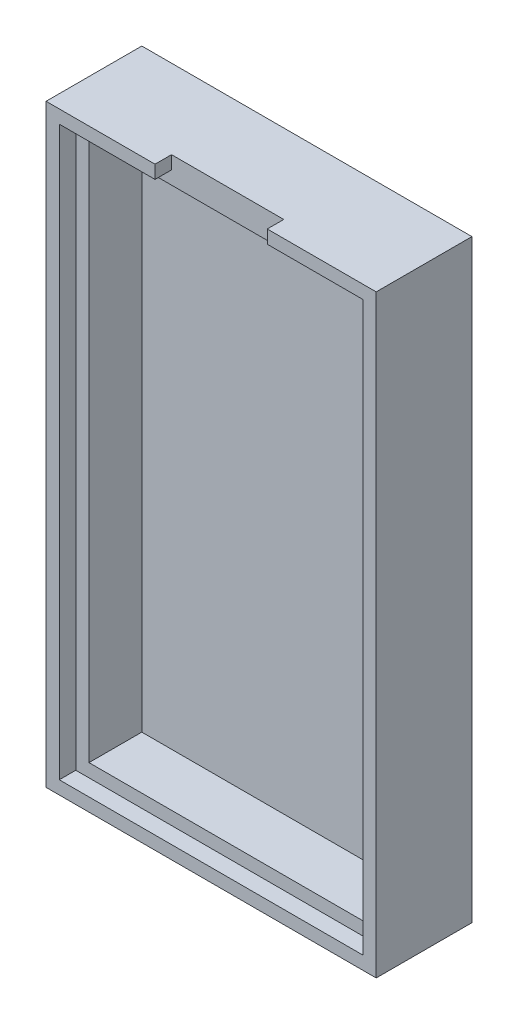
ISO-10303-21;
HEADER;
FILE_DESCRIPTION(('STEP AP214'),'2;1');
FILE_NAME('part.step','',(''),(''),'','','');
FILE_SCHEMA(('AUTOMOTIVE_DESIGN { 1 0 10303 214 1 1 1 1 }'));
ENDSEC;
DATA;
#1=APPLICATION_CONTEXT('core data for automotive mechanical design processes');
#2=APPLICATION_PROTOCOL_DEFINITION('international standard','automotive_design',2000,#1);
#3=PRODUCT_CONTEXT('',#1,'mechanical');
#4=PRODUCT('Part','Part','',(#3));
#5=PRODUCT_RELATED_PRODUCT_CATEGORY('part','',(#4));
#6=PRODUCT_DEFINITION_FORMATION('','',#4);
#7=PRODUCT_DEFINITION_CONTEXT('part definition',#1,'design');
#8=PRODUCT_DEFINITION('design','',#6,#7);
#9=PRODUCT_DEFINITION_SHAPE('','',#8);
#10=(LENGTH_UNIT() NAMED_UNIT(*) SI_UNIT(.MILLI.,.METRE.));
#11=(NAMED_UNIT(*) PLANE_ANGLE_UNIT() SI_UNIT($,.RADIAN.));
#12=(NAMED_UNIT(*) SI_UNIT($,.STERADIAN.) SOLID_ANGLE_UNIT());
#13=UNCERTAINTY_MEASURE_WITH_UNIT(LENGTH_MEASURE(1.E-05),#10,'distance_accuracy_value','');
#14=(GEOMETRIC_REPRESENTATION_CONTEXT(3) GLOBAL_UNCERTAINTY_ASSIGNED_CONTEXT((#13)) GLOBAL_UNIT_ASSIGNED_CONTEXT((#10,
#11,#12)) REPRESENTATION_CONTEXT('',''));
#15=CARTESIAN_POINT('',(0.,0.,0.));
#16=DIRECTION('',(0.,0.,1.));
#17=DIRECTION('',(1.,0.,0.));
#18=AXIS2_PLACEMENT_3D('',#15,#16,#17);
#19=CARTESIAN_POINT('',(-15.875,28.575,4.60375));
#20=DIRECTION('',(1.,0.,0.));
#21=DIRECTION('',(0.,0.,-1.));
#22=AXIS2_PLACEMENT_3D('',#19,#20,#21);
#23=PLANE('',#22);
#24=DIRECTION('',(0.,-1.,0.));
#25=VECTOR('',#24,1.);
#26=CARTESIAN_POINT('',(-15.875,28.575,-4.60375));
#27=LINE('',#26,#25);
#28=CARTESIAN_POINT('',(-15.875,28.575,-4.60375));
#29=VERTEX_POINT('',#28);
#30=CARTESIAN_POINT('',(-15.875,-28.575,-4.60375));
#31=VERTEX_POINT('',#30);
#32=EDGE_CURVE('E231',#29,#31,#27,.T.);
#33=ORIENTED_EDGE('',*,*,#32,.T.);
#34=DIRECTION('',(0.,0.,-1.));
#35=VECTOR('',#34,1.);
#36=CARTESIAN_POINT('',(-15.875,-28.575,4.60375));
#37=LINE('',#36,#35);
#38=CARTESIAN_POINT('',(-15.875,-28.575,4.60375));
#39=VERTEX_POINT('',#38);
#40=EDGE_CURVE('E42',#39,#31,#37,.T.);
#41=ORIENTED_EDGE('',*,*,#40,.F.);
#42=DIRECTION('',(0.,-1.,0.));
#43=VECTOR('',#42,1.);
#44=CARTESIAN_POINT('',(-15.875,28.575,4.60375));
#45=LINE('',#44,#43);
#46=CARTESIAN_POINT('',(-15.875,28.575,4.60375));
#47=VERTEX_POINT('',#46);
#48=EDGE_CURVE('E246',#47,#39,#45,.T.);
#49=ORIENTED_EDGE('',*,*,#48,.F.);
#50=DIRECTION('',(0.,0.,-1.));
#51=VECTOR('',#50,1.);
#52=CARTESIAN_POINT('',(-15.875,28.575,4.60375));
#53=LINE('',#52,#51);
#54=EDGE_CURVE('E254',#47,#29,#53,.T.);
#55=ORIENTED_EDGE('',*,*,#54,.T.);
#56=EDGE_LOOP('',(#33,#41,#49,#55));
#57=FACE_BOUND('',#56,.T.);
#58=ADVANCED_FACE('F35',(#57),#23,.F.);
#59=CARTESIAN_POINT('',(-15.875,-28.575,4.60375));
#60=DIRECTION('',(0.,1.,0.));
#61=DIRECTION('',(0.,0.,1.));
#62=AXIS2_PLACEMENT_3D('',#59,#60,#61);
#63=PLANE('',#62);
#64=DIRECTION('',(1.,0.,0.));
#65=VECTOR('',#64,1.);
#66=CARTESIAN_POINT('',(-15.875,-28.575,-4.60375));
#67=LINE('',#66,#65);
#68=CARTESIAN_POINT('',(15.875,-28.575,-4.60375));
#69=VERTEX_POINT('',#68);
#70=EDGE_CURVE('E257',#31,#69,#67,.T.);
#71=ORIENTED_EDGE('',*,*,#70,.T.);
#72=DIRECTION('',(0.,0.,-1.));
#73=VECTOR('',#72,1.);
#74=CARTESIAN_POINT('',(15.875,-28.575,4.60375));
#75=LINE('',#74,#73);
#76=CARTESIAN_POINT('',(15.875,-28.575,4.60375));
#77=VERTEX_POINT('',#76);
#78=EDGE_CURVE('E265',#77,#69,#75,.T.);
#79=ORIENTED_EDGE('',*,*,#78,.F.);
#80=DIRECTION('',(1.,0.,0.));
#81=VECTOR('',#80,1.);
#82=CARTESIAN_POINT('',(-15.875,-28.575,4.60375));
#83=LINE('',#82,#81);
#84=EDGE_CURVE('E87',#39,#77,#83,.T.);
#85=ORIENTED_EDGE('',*,*,#84,.F.);
#86=ORIENTED_EDGE('',*,*,#40,.T.);
#87=EDGE_LOOP('',(#71,#79,#85,#86));
#88=FACE_BOUND('',#87,.T.);
#89=ADVANCED_FACE('F268',(#88),#63,.F.);
#90=CARTESIAN_POINT('',(15.875,28.575,4.60375));
#91=DIRECTION('',(-1.,0.,0.));
#92=DIRECTION('',(0.,0.,1.));
#93=AXIS2_PLACEMENT_3D('',#90,#91,#92);
#94=PLANE('',#93);
#95=DIRECTION('',(0.,1.,0.));
#96=VECTOR('',#95,1.);
#97=CARTESIAN_POINT('',(15.875,28.575,-4.60375));
#98=LINE('',#97,#96);
#99=CARTESIAN_POINT('',(15.875,28.575,-4.60375));
#100=VERTEX_POINT('',#99);
#101=EDGE_CURVE('E259',#69,#100,#98,.T.);
#102=ORIENTED_EDGE('',*,*,#101,.T.);
#103=DIRECTION('',(0.,0.,-1.));
#104=VECTOR('',#103,1.);
#105=CARTESIAN_POINT('',(15.875,28.575,4.60375));
#106=LINE('',#105,#104);
#107=CARTESIAN_POINT('',(15.875,28.575,4.60375));
#108=VERTEX_POINT('',#107);
#109=EDGE_CURVE('E263',#108,#100,#106,.T.);
#110=ORIENTED_EDGE('',*,*,#109,.F.);
#111=DIRECTION('',(0.,1.,0.));
#112=VECTOR('',#111,1.);
#113=CARTESIAN_POINT('',(15.875,28.575,4.60375));
#114=LINE('',#113,#112);
#115=EDGE_CURVE('E249',#77,#108,#114,.T.);
#116=ORIENTED_EDGE('',*,*,#115,.F.);
#117=ORIENTED_EDGE('',*,*,#78,.T.);
#118=EDGE_LOOP('',(#102,#110,#116,#117));
#119=FACE_BOUND('',#118,.T.);
#120=ADVANCED_FACE('F277',(#119),#94,.F.);
#121=CARTESIAN_POINT('',(-15.875,28.575,4.60375));
#122=DIRECTION('',(0.,-1.,0.));
#123=DIRECTION('',(0.,0.,-1.));
#124=AXIS2_PLACEMENT_3D('',#121,#122,#123);
#125=PLANE('',#124);
#126=DIRECTION('',(-1.,0.,0.));
#127=VECTOR('',#126,1.);
#128=CARTESIAN_POINT('',(-5.3975,28.575,3.01625));
#129=LINE('',#128,#127);
#130=CARTESIAN_POINT('',(5.3975,28.575,3.01625));
#131=VERTEX_POINT('',#130);
#132=CARTESIAN_POINT('',(-5.3975,28.575,3.01625));
#133=VERTEX_POINT('',#132);
#134=EDGE_CURVE('E207',#131,#133,#129,.T.);
#135=ORIENTED_EDGE('',*,*,#134,.F.);
#136=DIRECTION('',(0.,0.,-1.));
#137=VECTOR('',#136,1.);
#138=CARTESIAN_POINT('',(5.3975,28.575,4.60375));
#139=LINE('',#138,#137);
#140=CARTESIAN_POINT('',(5.3975,28.575,4.60375));
#141=VERTEX_POINT('',#140);
#142=EDGE_CURVE('E211',#141,#131,#139,.T.);
#143=ORIENTED_EDGE('',*,*,#142,.F.);
#144=DIRECTION('',(-1.,0.,0.));
#145=VECTOR('',#144,1.);
#146=CARTESIAN_POINT('',(-15.875,28.575,4.60375));
#147=LINE('',#146,#145);
#148=EDGE_CURVE('E251',#108,#141,#147,.T.);
#149=ORIENTED_EDGE('',*,*,#148,.F.);
#150=ORIENTED_EDGE('',*,*,#109,.T.);
#151=DIRECTION('',(-1.,0.,0.));
#152=VECTOR('',#151,1.);
#153=CARTESIAN_POINT('',(-15.875,28.575,-4.60375));
#154=LINE('',#153,#152);
#155=EDGE_CURVE('E79',#100,#29,#154,.T.);
#156=ORIENTED_EDGE('',*,*,#155,.T.);
#157=ORIENTED_EDGE('',*,*,#54,.F.);
#158=CARTESIAN_POINT('',(-5.3975,28.575,4.60375));
#159=VERTEX_POINT('',#158);
#160=EDGE_CURVE('E57',#159,#47,#147,.T.);
#161=ORIENTED_EDGE('',*,*,#160,.F.);
#162=DIRECTION('',(0.,0.,1.));
#163=VECTOR('',#162,1.);
#164=CARTESIAN_POINT('',(-5.3975,28.575,4.60375));
#165=LINE('',#164,#163);
#166=EDGE_CURVE('E206',#133,#159,#165,.T.);
#167=ORIENTED_EDGE('',*,*,#166,.F.);
#168=EDGE_LOOP('',(#135,#143,#149,#150,#156,#157,#161,#167));
#169=FACE_BOUND('',#168,.T.);
#170=ADVANCED_FACE('F281',(#169),#125,.F.);
#171=CARTESIAN_POINT('',(0.,0.,4.60375));
#172=DIRECTION('',(0.,0.,1.));
#173=DIRECTION('',(1.,0.,0.));
#174=AXIS2_PLACEMENT_3D('',#171,#172,#173);
#175=PLANE('',#174);
#176=DIRECTION('',(-1.,0.,0.));
#177=VECTOR('',#176,1.);
#178=CARTESIAN_POINT('',(14.605,27.305,4.60375));
#179=LINE('',#178,#177);
#180=CARTESIAN_POINT('',(14.605,27.305,4.60375));
#181=VERTEX_POINT('',#180);
#182=CARTESIAN_POINT('',(5.3975,27.305,4.60375));
#183=VERTEX_POINT('',#182);
#184=EDGE_CURVE('E183',#181,#183,#179,.T.);
#185=ORIENTED_EDGE('',*,*,#184,.F.);
#186=DIRECTION('',(0.,1.,0.));
#187=VECTOR('',#186,1.);
#188=CARTESIAN_POINT('',(14.605,-27.305,4.60375));
#189=LINE('',#188,#187);
#190=CARTESIAN_POINT('',(14.605,-27.305,4.60375));
#191=VERTEX_POINT('',#190);
#192=EDGE_CURVE('E172',#191,#181,#189,.T.);
#193=ORIENTED_EDGE('',*,*,#192,.F.);
#194=DIRECTION('',(1.,0.,0.));
#195=VECTOR('',#194,1.);
#196=CARTESIAN_POINT('',(-14.605,-27.305,4.60375));
#197=LINE('',#196,#195);
#198=CARTESIAN_POINT('',(-14.605,-27.305,4.60375));
#199=VERTEX_POINT('',#198);
#200=EDGE_CURVE('E187',#199,#191,#197,.T.);
#201=ORIENTED_EDGE('',*,*,#200,.F.);
#202=DIRECTION('',(0.,-1.,0.));
#203=VECTOR('',#202,1.);
#204=CARTESIAN_POINT('',(-14.605,27.305,4.60375));
#205=LINE('',#204,#203);
#206=CARTESIAN_POINT('',(-14.605,27.305,4.60375));
#207=VERTEX_POINT('',#206);
#208=EDGE_CURVE('E180',#207,#199,#205,.T.);
#209=ORIENTED_EDGE('',*,*,#208,.F.);
#210=CARTESIAN_POINT('',(-5.3975,27.305,4.60375));
#211=VERTEX_POINT('',#210);
#212=EDGE_CURVE('E294',#211,#207,#179,.T.);
#213=ORIENTED_EDGE('',*,*,#212,.F.);
#214=DIRECTION('',(0.,1.,0.));
#215=VECTOR('',#214,1.);
#216=CARTESIAN_POINT('',(-5.3975,15.1238964238259,4.60375));
#217=LINE('',#216,#215);
#218=EDGE_CURVE('E221',#211,#159,#217,.T.);
#219=ORIENTED_EDGE('',*,*,#218,.T.);
#220=ORIENTED_EDGE('',*,*,#160,.T.);
#221=ORIENTED_EDGE('',*,*,#48,.T.);
#222=ORIENTED_EDGE('',*,*,#84,.T.);
#223=ORIENTED_EDGE('',*,*,#115,.T.);
#224=ORIENTED_EDGE('',*,*,#148,.T.);
#225=DIRECTION('',(0.,1.,0.));
#226=VECTOR('',#225,1.);
#227=CARTESIAN_POINT('',(5.3975,15.1238964238259,4.60375));
#228=LINE('',#227,#226);
#229=EDGE_CURVE('E210',#183,#141,#228,.T.);
#230=ORIENTED_EDGE('',*,*,#229,.F.);
#231=EDGE_LOOP('',(#185,#193,#201,#209,#213,#219,#220,#221,#222,#223,#224,#230));
#232=FACE_BOUND('',#231,.T.);
#233=ADVANCED_FACE('F284',(#232),#175,.T.);
#234=CARTESIAN_POINT('',(0.,0.,-4.60375));
#235=DIRECTION('',(0.,0.,1.));
#236=DIRECTION('',(1.,0.,0.));
#237=AXIS2_PLACEMENT_3D('',#234,#235,#236);
#238=PLANE('',#237);
#239=ORIENTED_EDGE('',*,*,#32,.F.);
#240=ORIENTED_EDGE('',*,*,#155,.F.);
#241=ORIENTED_EDGE('',*,*,#101,.F.);
#242=ORIENTED_EDGE('',*,*,#70,.F.);
#243=EDGE_LOOP('',(#239,#240,#241,#242));
#244=FACE_BOUND('',#243,.T.);
#245=ADVANCED_FACE('F273',(#244),#238,.F.);
#246=CARTESIAN_POINT('',(-13.335,28.575,4.60375));
#247=DIRECTION('',(1.,0.,0.));
#248=DIRECTION('',(0.,0.,-1.));
#249=AXIS2_PLACEMENT_3D('',#246,#247,#248);
#250=PLANE('',#249);
#251=DIRECTION('',(0.,1.,0.));
#252=VECTOR('',#251,1.);
#253=CARTESIAN_POINT('',(-13.335,28.575,3.01625));
#254=LINE('',#253,#252);
#255=CARTESIAN_POINT('',(-13.335,-26.035,3.01625));
#256=VERTEX_POINT('',#255);
#257=CARTESIAN_POINT('',(-13.335,26.035,3.01625));
#258=VERTEX_POINT('',#257);
#259=EDGE_CURVE('E203',#256,#258,#254,.T.);
#260=ORIENTED_EDGE('',*,*,#259,.F.);
#261=DIRECTION('',(0.,0.,-1.));
#262=VECTOR('',#261,1.);
#263=CARTESIAN_POINT('',(-13.335,-26.035,4.60375));
#264=LINE('',#263,#262);
#265=CARTESIAN_POINT('',(-13.335,-26.035,-2.06375));
#266=VERTEX_POINT('',#265);
#267=EDGE_CURVE('E229',#256,#266,#264,.T.);
#268=ORIENTED_EDGE('',*,*,#267,.T.);
#269=DIRECTION('',(0.,-1.,0.));
#270=VECTOR('',#269,1.);
#271=CARTESIAN_POINT('',(-13.335,28.575,-2.06375));
#272=LINE('',#271,#270);
#273=CARTESIAN_POINT('',(-13.335,26.035,-2.06375));
#274=VERTEX_POINT('',#273);
#275=EDGE_CURVE('E225',#274,#266,#272,.T.);
#276=ORIENTED_EDGE('',*,*,#275,.F.);
#277=DIRECTION('',(0.,0.,-1.));
#278=VECTOR('',#277,1.);
#279=CARTESIAN_POINT('',(-13.335,26.035,4.60375));
#280=LINE('',#279,#278);
#281=EDGE_CURVE('E233',#258,#274,#280,.T.);
#282=ORIENTED_EDGE('',*,*,#281,.F.);
#283=EDGE_LOOP('',(#260,#268,#276,#282));
#284=FACE_BOUND('',#283,.T.);
#285=ADVANCED_FACE('F327',(#284),#250,.T.);
#286=CARTESIAN_POINT('',(-15.875,-26.035,4.60375));
#287=DIRECTION('',(0.,1.,0.));
#288=DIRECTION('',(0.,0.,1.));
#289=AXIS2_PLACEMENT_3D('',#286,#287,#288);
#290=PLANE('',#289);
#291=DIRECTION('',(-1.,0.,0.));
#292=VECTOR('',#291,1.);
#293=CARTESIAN_POINT('',(-15.875,-26.035,3.01625));
#294=LINE('',#293,#292);
#295=CARTESIAN_POINT('',(13.335,-26.035,3.01625));
#296=VERTEX_POINT('',#295);
#297=EDGE_CURVE('E201',#296,#256,#294,.T.);
#298=ORIENTED_EDGE('',*,*,#297,.F.);
#299=DIRECTION('',(0.,0.,-1.));
#300=VECTOR('',#299,1.);
#301=CARTESIAN_POINT('',(13.335,-26.035,4.60375));
#302=LINE('',#301,#300);
#303=CARTESIAN_POINT('',(13.335,-26.035,-2.06375));
#304=VERTEX_POINT('',#303);
#305=EDGE_CURVE('E232',#296,#304,#302,.T.);
#306=ORIENTED_EDGE('',*,*,#305,.T.);
#307=DIRECTION('',(1.,0.,0.));
#308=VECTOR('',#307,1.);
#309=CARTESIAN_POINT('',(-15.875,-26.035,-2.06375));
#310=LINE('',#309,#308);
#311=EDGE_CURVE('E228',#266,#304,#310,.T.);
#312=ORIENTED_EDGE('',*,*,#311,.F.);
#313=ORIENTED_EDGE('',*,*,#267,.F.);
#314=EDGE_LOOP('',(#298,#306,#312,#313));
#315=FACE_BOUND('',#314,.T.);
#316=ADVANCED_FACE('F341',(#315),#290,.T.);
#317=CARTESIAN_POINT('',(13.335,28.575,4.60375));
#318=DIRECTION('',(-1.,0.,0.));
#319=DIRECTION('',(0.,0.,1.));
#320=AXIS2_PLACEMENT_3D('',#317,#318,#319);
#321=PLANE('',#320);
#322=DIRECTION('',(0.,-1.,0.));
#323=VECTOR('',#322,1.);
#324=CARTESIAN_POINT('',(13.335,28.575,3.01625));
#325=LINE('',#324,#323);
#326=CARTESIAN_POINT('',(13.335,26.035,3.01625));
#327=VERTEX_POINT('',#326);
#328=EDGE_CURVE('E199',#327,#296,#325,.T.);
#329=ORIENTED_EDGE('',*,*,#328,.F.);
#330=DIRECTION('',(0.,0.,-1.));
#331=VECTOR('',#330,1.);
#332=CARTESIAN_POINT('',(13.335,26.035,4.60375));
#333=LINE('',#332,#331);
#334=CARTESIAN_POINT('',(13.335,26.035,-2.06375));
#335=VERTEX_POINT('',#334);
#336=EDGE_CURVE('E235',#327,#335,#333,.T.);
#337=ORIENTED_EDGE('',*,*,#336,.T.);
#338=DIRECTION('',(0.,1.,0.));
#339=VECTOR('',#338,1.);
#340=CARTESIAN_POINT('',(13.335,28.575,-2.06375));
#341=LINE('',#340,#339);
#342=EDGE_CURVE('E239',#304,#335,#341,.T.);
#343=ORIENTED_EDGE('',*,*,#342,.F.);
#344=ORIENTED_EDGE('',*,*,#305,.F.);
#345=EDGE_LOOP('',(#329,#337,#343,#344));
#346=FACE_BOUND('',#345,.T.);
#347=ADVANCED_FACE('F337',(#346),#321,.T.);
#348=CARTESIAN_POINT('',(-15.875,26.035,4.60375));
#349=DIRECTION('',(0.,-1.,0.));
#350=DIRECTION('',(0.,0.,-1.));
#351=AXIS2_PLACEMENT_3D('',#348,#349,#350);
#352=PLANE('',#351);
#353=DIRECTION('',(-1.,0.,0.));
#354=VECTOR('',#353,1.);
#355=CARTESIAN_POINT('',(-5.3975,26.035,3.01625));
#356=LINE('',#355,#354);
#357=EDGE_CURVE('E216',#327,#258,#356,.T.);
#358=ORIENTED_EDGE('',*,*,#357,.T.);
#359=ORIENTED_EDGE('',*,*,#281,.T.);
#360=DIRECTION('',(-1.,0.,0.));
#361=VECTOR('',#360,1.);
#362=CARTESIAN_POINT('',(-15.875,26.035,-2.06375));
#363=LINE('',#362,#361);
#364=EDGE_CURVE('E236',#335,#274,#363,.T.);
#365=ORIENTED_EDGE('',*,*,#364,.F.);
#366=ORIENTED_EDGE('',*,*,#336,.F.);
#367=EDGE_LOOP('',(#358,#359,#365,#366));
#368=FACE_BOUND('',#367,.T.);
#369=ADVANCED_FACE('F333',(#368),#352,.T.);
#370=CARTESIAN_POINT('',(0.,0.,-2.06375));
#371=DIRECTION('',(0.,0.,1.));
#372=DIRECTION('',(1.,0.,0.));
#373=AXIS2_PLACEMENT_3D('',#370,#371,#372);
#374=PLANE('',#373);
#375=ORIENTED_EDGE('',*,*,#275,.T.);
#376=ORIENTED_EDGE('',*,*,#311,.T.);
#377=ORIENTED_EDGE('',*,*,#342,.T.);
#378=ORIENTED_EDGE('',*,*,#364,.T.);
#379=EDGE_LOOP('',(#375,#376,#377,#378));
#380=FACE_BOUND('',#379,.T.);
#381=ADVANCED_FACE('F330',(#380),#374,.T.);
#382=CARTESIAN_POINT('',(5.3975,15.1238964238259,4.60375));
#383=DIRECTION('',(1.,0.,0.));
#384=DIRECTION('',(0.,0.,-1.));
#385=AXIS2_PLACEMENT_3D('',#382,#383,#384);
#386=PLANE('',#385);
#387=DIRECTION('',(0.,1.,0.));
#388=VECTOR('',#387,1.);
#389=CARTESIAN_POINT('',(5.3975,15.1238964238259,3.01625));
#390=LINE('',#389,#388);
#391=CARTESIAN_POINT('',(5.3975,27.305,3.01625));
#392=VERTEX_POINT('',#391);
#393=EDGE_CURVE('E219',#392,#131,#390,.T.);
#394=ORIENTED_EDGE('',*,*,#393,.F.);
#395=DIRECTION('',(0.,0.,1.));
#396=VECTOR('',#395,1.);
#397=CARTESIAN_POINT('',(5.3975,27.305,4.60375));
#398=LINE('',#397,#396);
#399=EDGE_CURVE('E161',#392,#183,#398,.T.);
#400=ORIENTED_EDGE('',*,*,#399,.T.);
#401=ORIENTED_EDGE('',*,*,#229,.T.);
#402=ORIENTED_EDGE('',*,*,#142,.T.);
#403=EDGE_LOOP('',(#394,#400,#401,#402));
#404=FACE_BOUND('',#403,.T.);
#405=ADVANCED_FACE('F286',(#404),#386,.F.);
#406=CARTESIAN_POINT('',(-5.3975,15.1238964238259,3.01625));
#407=DIRECTION('',(0.,0.,-1.));
#408=DIRECTION('',(-1.,0.,0.));
#409=AXIS2_PLACEMENT_3D('',#406,#407,#408);
#410=PLANE('',#409);
#411=DIRECTION('',(-1.,0.,0.));
#412=VECTOR('',#411,1.);
#413=CARTESIAN_POINT('',(14.605,27.305,3.01625));
#414=LINE('',#413,#412);
#415=CARTESIAN_POINT('',(14.605,27.305,3.01625));
#416=VERTEX_POINT('',#415);
#417=EDGE_CURVE('E155',#416,#392,#414,.T.);
#418=ORIENTED_EDGE('',*,*,#417,.T.);
#419=ORIENTED_EDGE('',*,*,#393,.T.);
#420=ORIENTED_EDGE('',*,*,#134,.T.);
#421=DIRECTION('',(0.,1.,0.));
#422=VECTOR('',#421,1.);
#423=CARTESIAN_POINT('',(-5.3975,15.1238964238259,3.01625));
#424=LINE('',#423,#422);
#425=CARTESIAN_POINT('',(-5.3975,27.305,3.01625));
#426=VERTEX_POINT('',#425);
#427=EDGE_CURVE('E218',#426,#133,#424,.T.);
#428=ORIENTED_EDGE('',*,*,#427,.F.);
#429=CARTESIAN_POINT('',(-14.605,27.305,3.01625));
#430=VERTEX_POINT('',#429);
#431=EDGE_CURVE('E49',#426,#430,#414,.T.);
#432=ORIENTED_EDGE('',*,*,#431,.T.);
#433=DIRECTION('',(0.,-1.,0.));
#434=VECTOR('',#433,1.);
#435=CARTESIAN_POINT('',(-14.605,27.305,3.01625));
#436=LINE('',#435,#434);
#437=CARTESIAN_POINT('',(-14.605,-27.305,3.01625));
#438=VERTEX_POINT('',#437);
#439=EDGE_CURVE('E192',#430,#438,#436,.T.);
#440=ORIENTED_EDGE('',*,*,#439,.T.);
#441=DIRECTION('',(1.,0.,0.));
#442=VECTOR('',#441,1.);
#443=CARTESIAN_POINT('',(-14.605,-27.305,3.01625));
#444=LINE('',#443,#442);
#445=CARTESIAN_POINT('',(14.605,-27.305,3.01625));
#446=VERTEX_POINT('',#445);
#447=EDGE_CURVE('E178',#438,#446,#444,.T.);
#448=ORIENTED_EDGE('',*,*,#447,.T.);
#449=DIRECTION('',(0.,1.,0.));
#450=VECTOR('',#449,1.);
#451=CARTESIAN_POINT('',(14.605,-27.305,3.01625));
#452=LINE('',#451,#450);
#453=EDGE_CURVE('E169',#446,#416,#452,.T.);
#454=ORIENTED_EDGE('',*,*,#453,.T.);
#455=EDGE_LOOP('',(#418,#419,#420,#428,#432,#440,#448,#454));
#456=FACE_BOUND('',#455,.T.);
#457=ORIENTED_EDGE('',*,*,#357,.F.);
#458=ORIENTED_EDGE('',*,*,#328,.T.);
#459=ORIENTED_EDGE('',*,*,#297,.T.);
#460=ORIENTED_EDGE('',*,*,#259,.T.);
#461=EDGE_LOOP('',(#457,#458,#459,#460));
#462=FACE_BOUND('',#461,.T.);
#463=ADVANCED_FACE('F175',(#456,#462),#410,.F.);
#464=CARTESIAN_POINT('',(-5.3975,15.1238964238259,4.60375));
#465=DIRECTION('',(-1.,0.,0.));
#466=DIRECTION('',(0.,0.,1.));
#467=AXIS2_PLACEMENT_3D('',#464,#465,#466);
#468=PLANE('',#467);
#469=ORIENTED_EDGE('',*,*,#218,.F.);
#470=DIRECTION('',(0.,0.,-1.));
#471=VECTOR('',#470,1.);
#472=CARTESIAN_POINT('',(-5.3975,27.305,4.60375));
#473=LINE('',#472,#471);
#474=EDGE_CURVE('E11',#211,#426,#473,.T.);
#475=ORIENTED_EDGE('',*,*,#474,.T.);
#476=ORIENTED_EDGE('',*,*,#427,.T.);
#477=ORIENTED_EDGE('',*,*,#166,.T.);
#478=EDGE_LOOP('',(#469,#475,#476,#477));
#479=FACE_BOUND('',#478,.T.);
#480=ADVANCED_FACE('F291',(#479),#468,.F.);
#481=CARTESIAN_POINT('',(14.605,27.305,-58.914971528402));
#482=DIRECTION('',(0.,1.,0.));
#483=DIRECTION('',(0.,0.,1.));
#484=AXIS2_PLACEMENT_3D('',#481,#482,#483);
#485=PLANE('',#484);
#486=ORIENTED_EDGE('',*,*,#417,.F.);
#487=DIRECTION('',(0.,0.,1.));
#488=VECTOR('',#487,1.);
#489=CARTESIAN_POINT('',(14.605,27.305,-58.914971528402));
#490=LINE('',#489,#488);
#491=EDGE_CURVE('E158',#416,#181,#490,.T.);
#492=ORIENTED_EDGE('',*,*,#491,.T.);
#493=ORIENTED_EDGE('',*,*,#184,.T.);
#494=ORIENTED_EDGE('',*,*,#399,.F.);
#495=EDGE_LOOP('',(#486,#492,#493,#494));
#496=FACE_BOUND('',#495,.T.);
#497=ADVANCED_FACE('F157',(#496),#485,.F.);
#498=ORIENTED_EDGE('',*,*,#212,.T.);
#499=DIRECTION('',(0.,0.,1.));
#500=VECTOR('',#499,1.);
#501=CARTESIAN_POINT('',(-14.605,27.305,-58.914971528402));
#502=LINE('',#501,#500);
#503=EDGE_CURVE('E165',#430,#207,#502,.T.);
#504=ORIENTED_EDGE('',*,*,#503,.F.);
#505=ORIENTED_EDGE('',*,*,#431,.F.);
#506=ORIENTED_EDGE('',*,*,#474,.F.);
#507=EDGE_LOOP('',(#498,#504,#505,#506));
#508=FACE_BOUND('',#507,.T.);
#509=ADVANCED_FACE('F293',(#508),#485,.F.);
#510=CARTESIAN_POINT('',(14.605,-27.305,-58.914971528402));
#511=DIRECTION('',(1.,0.,0.));
#512=DIRECTION('',(0.,0.,-1.));
#513=AXIS2_PLACEMENT_3D('',#510,#511,#512);
#514=PLANE('',#513);
#515=DIRECTION('',(0.,0.,1.));
#516=VECTOR('',#515,1.);
#517=CARTESIAN_POINT('',(14.605,-27.305,-58.914971528402));
#518=LINE('',#517,#516);
#519=EDGE_CURVE('E190',#446,#191,#518,.T.);
#520=ORIENTED_EDGE('',*,*,#519,.T.);
#521=ORIENTED_EDGE('',*,*,#192,.T.);
#522=ORIENTED_EDGE('',*,*,#491,.F.);
#523=ORIENTED_EDGE('',*,*,#453,.F.);
#524=EDGE_LOOP('',(#520,#521,#522,#523));
#525=FACE_BOUND('',#524,.T.);
#526=ADVANCED_FACE('F168',(#525),#514,.F.);
#527=CARTESIAN_POINT('',(-14.605,27.305,-58.914971528402));
#528=DIRECTION('',(-1.,0.,0.));
#529=DIRECTION('',(0.,0.,1.));
#530=AXIS2_PLACEMENT_3D('',#527,#528,#529);
#531=PLANE('',#530);
#532=ORIENTED_EDGE('',*,*,#503,.T.);
#533=ORIENTED_EDGE('',*,*,#208,.T.);
#534=DIRECTION('',(0.,0.,1.));
#535=VECTOR('',#534,1.);
#536=CARTESIAN_POINT('',(-14.605,-27.305,-58.914971528402));
#537=LINE('',#536,#535);
#538=EDGE_CURVE('E191',#438,#199,#537,.T.);
#539=ORIENTED_EDGE('',*,*,#538,.F.);
#540=ORIENTED_EDGE('',*,*,#439,.F.);
#541=EDGE_LOOP('',(#532,#533,#539,#540));
#542=FACE_BOUND('',#541,.T.);
#543=ADVANCED_FACE('F304',(#542),#531,.F.);
#544=CARTESIAN_POINT('',(-14.605,-27.305,-58.914971528402));
#545=DIRECTION('',(0.,-1.,0.));
#546=DIRECTION('',(0.,0.,-1.));
#547=AXIS2_PLACEMENT_3D('',#544,#545,#546);
#548=PLANE('',#547);
#549=ORIENTED_EDGE('',*,*,#538,.T.);
#550=ORIENTED_EDGE('',*,*,#200,.T.);
#551=ORIENTED_EDGE('',*,*,#519,.F.);
#552=ORIENTED_EDGE('',*,*,#447,.F.);
#553=EDGE_LOOP('',(#549,#550,#551,#552));
#554=FACE_BOUND('',#553,.T.);
#555=ADVANCED_FACE('F300',(#554),#548,.F.);
#556=CLOSED_SHELL('',(#58,#89,#120,#170,#233,#245,#285,#316,#347,#369,#381,#405,#463,#480,#497,
#509,#526,#543,#555));
#557=MANIFOLD_SOLID_BREP('B2',#556);
#558=ADVANCED_BREP_SHAPE_REPRESENTATION('',(#18,#557),#14);
#559=SHAPE_DEFINITION_REPRESENTATION(#9,#558);
ENDSEC;
END-ISO-10303-21;
